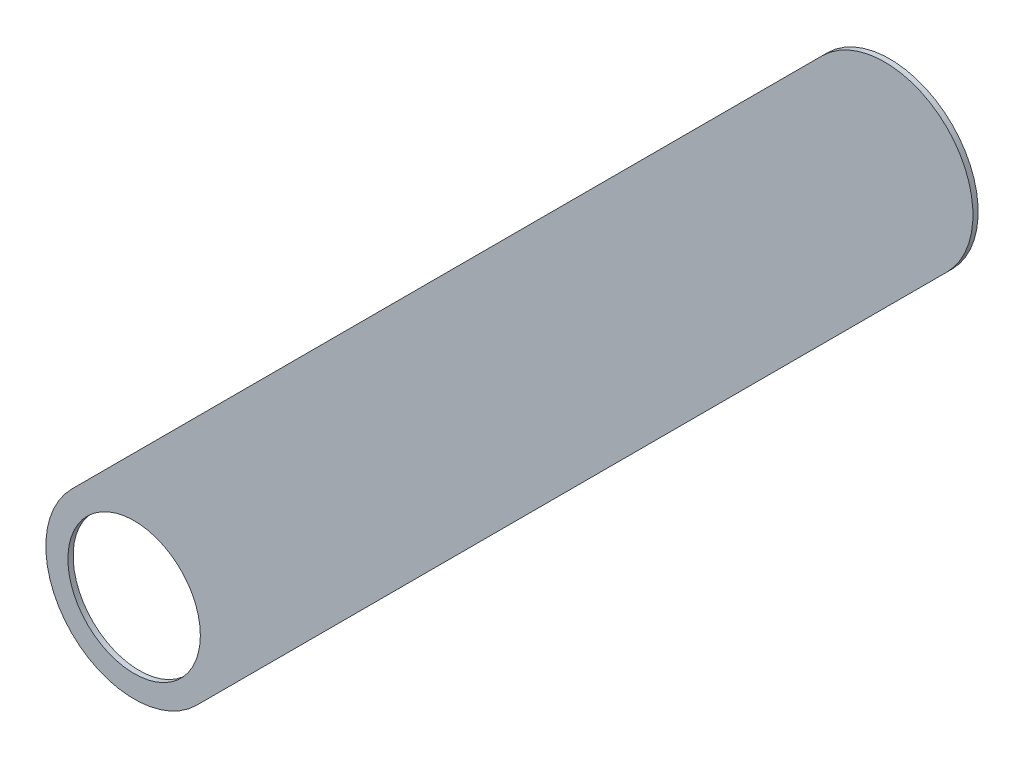
ISO-10303-21;
HEADER;
FILE_DESCRIPTION(('STEP AP214'),'2;1');
FILE_NAME('part.step','',(''),(''),'','','');
FILE_SCHEMA(('AUTOMOTIVE_DESIGN { 1 0 10303 214 1 1 1 1 }'));
ENDSEC;
DATA;
#1=APPLICATION_CONTEXT('core data for automotive mechanical design processes');
#2=APPLICATION_PROTOCOL_DEFINITION('international standard','automotive_design',2000,#1);
#3=PRODUCT_CONTEXT('',#1,'mechanical');
#4=PRODUCT('Part','Part','',(#3));
#5=PRODUCT_RELATED_PRODUCT_CATEGORY('part','',(#4));
#6=PRODUCT_DEFINITION_FORMATION('','',#4);
#7=PRODUCT_DEFINITION_CONTEXT('part definition',#1,'design');
#8=PRODUCT_DEFINITION('design','',#6,#7);
#9=PRODUCT_DEFINITION_SHAPE('','',#8);
#10=(LENGTH_UNIT() NAMED_UNIT(*) SI_UNIT(.MILLI.,.METRE.));
#11=(NAMED_UNIT(*) PLANE_ANGLE_UNIT() SI_UNIT($,.RADIAN.));
#12=(NAMED_UNIT(*) SI_UNIT($,.STERADIAN.) SOLID_ANGLE_UNIT());
#13=UNCERTAINTY_MEASURE_WITH_UNIT(LENGTH_MEASURE(1.E-05),#10,'distance_accuracy_value','');
#14=(GEOMETRIC_REPRESENTATION_CONTEXT(3) GLOBAL_UNCERTAINTY_ASSIGNED_CONTEXT((#13)) GLOBAL_UNIT_ASSIGNED_CONTEXT((#10,
#11,#12)) REPRESENTATION_CONTEXT('',''));
#15=CARTESIAN_POINT('',(0.,0.,0.));
#16=DIRECTION('',(0.,0.,1.));
#17=DIRECTION('',(1.,0.,0.));
#18=AXIS2_PLACEMENT_3D('',#15,#16,#17);
#19=CARTESIAN_POINT('',(117.72425782,71.51574978,0.));
#20=DIRECTION('',(-0.707106781186547,0.707106781186549,0.));
#21=DIRECTION('',(0.707106781186549,0.707106781186547,0.));
#22=AXIS2_PLACEMENT_3D('',#19,#20,#21);
#23=PLANE('',#22);
#24=DIRECTION('',(0.707106781186549,0.707106781186547,0.));
#25=VECTOR('',#24,1.);
#26=CARTESIAN_POINT('',(117.72425782,71.51574978,0.03556));
#27=LINE('',#26,#25);
#28=CARTESIAN_POINT('',(117.72425782,71.51574978,0.03556));
#29=VERTEX_POINT('',#28);
#30=CARTESIAN_POINT('',(122.82426286,76.61575482,0.03556));
#31=VERTEX_POINT('',#30);
#32=EDGE_CURVE('E11',#29,#31,#27,.T.);
#33=ORIENTED_EDGE('',*,*,#32,.F.);
#34=DIRECTION('',(0.,0.,1.));
#35=VECTOR('',#34,1.);
#36=CARTESIAN_POINT('',(117.72425782,71.51574978,0.));
#37=LINE('',#36,#35);
#38=CARTESIAN_POINT('',(117.72425782,71.51574978,0.));
#39=VERTEX_POINT('',#38);
#40=EDGE_CURVE('E24',#39,#29,#37,.T.);
#41=ORIENTED_EDGE('',*,*,#40,.F.);
#42=DIRECTION('',(0.707106781186549,0.707106781186547,0.));
#43=VECTOR('',#42,1.);
#44=CARTESIAN_POINT('',(117.72425782,71.51574978,0.));
#45=LINE('',#44,#43);
#46=CARTESIAN_POINT('',(122.82426286,76.61575482,0.));
#47=VERTEX_POINT('',#46);
#48=EDGE_CURVE('E96',#39,#47,#45,.T.);
#49=ORIENTED_EDGE('',*,*,#48,.T.);
#50=DIRECTION('',(0.,0.,1.));
#51=VECTOR('',#50,1.);
#52=CARTESIAN_POINT('',(122.82426286,76.61575482,0.));
#53=LINE('',#52,#51);
#54=EDGE_CURVE('E37',#47,#31,#53,.T.);
#55=ORIENTED_EDGE('',*,*,#54,.T.);
#56=EDGE_LOOP('',(#33,#41,#49,#55));
#57=FACE_BOUND('',#56,.T.);
#58=ADVANCED_FACE('F17',(#57),#23,.F.);
#59=CARTESIAN_POINT('',(117.299994,71.9400136,0.));
#60=DIRECTION('',(0.,0.,-1.));
#61=DIRECTION('',(-0.707106781186548,0.707106781186548,0.));
#62=AXIS2_PLACEMENT_3D('',#59,#60,#61);
#63=CYLINDRICAL_SURFACE('',#62,0.599999648268208);
#64=CARTESIAN_POINT('',(117.299994,71.9400136,0.03556));
#65=DIRECTION('',(0.,0.,1.));
#66=DIRECTION('',(-0.707106781186548,0.707106781186548,0.));
#67=AXIS2_PLACEMENT_3D('',#64,#65,#66);
#68=CIRCLE('',#67,0.599999648268208);
#69=CARTESIAN_POINT('',(116.87573018,72.36427742,0.03556));
#70=VERTEX_POINT('',#69);
#71=EDGE_CURVE('E92',#70,#29,#68,.T.);
#72=ORIENTED_EDGE('',*,*,#71,.F.);
#73=DIRECTION('',(0.,0.,1.));
#74=VECTOR('',#73,1.);
#75=CARTESIAN_POINT('',(116.87573018,72.36427742,0.));
#76=LINE('',#75,#74);
#77=CARTESIAN_POINT('',(116.87573018,72.36427742,0.));
#78=VERTEX_POINT('',#77);
#79=EDGE_CURVE('E90',#78,#70,#76,.T.);
#80=ORIENTED_EDGE('',*,*,#79,.F.);
#81=CARTESIAN_POINT('',(117.299994,71.9400136,0.));
#82=DIRECTION('',(0.,0.,1.));
#83=DIRECTION('',(-0.707106781186548,0.707106781186548,0.));
#84=AXIS2_PLACEMENT_3D('',#81,#82,#83);
#85=CIRCLE('',#84,0.599999648268208);
#86=EDGE_CURVE('E88',#78,#39,#85,.T.);
#87=ORIENTED_EDGE('',*,*,#86,.T.);
#88=ORIENTED_EDGE('',*,*,#40,.T.);
#89=EDGE_LOOP('',(#72,#80,#87,#88));
#90=FACE_BOUND('',#89,.T.);
#91=ADVANCED_FACE('F111',(#90),#63,.T.);
#92=CARTESIAN_POINT('',(122.39999904,77.04001864,0.));
#93=DIRECTION('',(0.,0.,-1.));
#94=DIRECTION('',(0.707106781186548,-0.707106781186548,0.));
#95=AXIS2_PLACEMENT_3D('',#92,#93,#94);
#96=CYLINDRICAL_SURFACE('',#95,0.599999648268218);
#97=CARTESIAN_POINT('',(122.39999904,77.04001864,0.03556));
#98=DIRECTION('',(0.,0.,1.));
#99=DIRECTION('',(0.707106781186548,-0.707106781186548,0.));
#100=AXIS2_PLACEMENT_3D('',#97,#98,#99);
#101=CIRCLE('',#100,0.599999648268218);
#102=CARTESIAN_POINT('',(121.97573522,77.46428246,0.03556));
#103=VERTEX_POINT('',#102);
#104=EDGE_CURVE('E85',#31,#103,#101,.T.);
#105=ORIENTED_EDGE('',*,*,#104,.F.);
#106=ORIENTED_EDGE('',*,*,#54,.F.);
#107=CARTESIAN_POINT('',(122.39999904,77.04001864,0.));
#108=DIRECTION('',(0.,0.,1.));
#109=DIRECTION('',(0.707106781186548,-0.707106781186548,0.));
#110=AXIS2_PLACEMENT_3D('',#107,#108,#109);
#111=CIRCLE('',#110,0.599999648268218);
#112=CARTESIAN_POINT('',(121.97573522,77.46428246,0.));
#113=VERTEX_POINT('',#112);
#114=EDGE_CURVE('E82',#47,#113,#111,.T.);
#115=ORIENTED_EDGE('',*,*,#114,.T.);
#116=DIRECTION('',(0.,0.,1.));
#117=VECTOR('',#116,1.);
#118=CARTESIAN_POINT('',(121.97573522,77.46428246,0.));
#119=LINE('',#118,#117);
#120=EDGE_CURVE('E80',#113,#103,#119,.T.);
#121=ORIENTED_EDGE('',*,*,#120,.T.);
#122=EDGE_LOOP('',(#105,#106,#115,#121));
#123=FACE_BOUND('',#122,.T.);
#124=ADVANCED_FACE('F104',(#123),#96,.T.);
#125=CARTESIAN_POINT('',(121.97573522,77.46428246,0.));
#126=DIRECTION('',(0.707106781186549,-0.707106781186547,0.));
#127=DIRECTION('',(-0.707106781186547,-0.707106781186549,0.));
#128=AXIS2_PLACEMENT_3D('',#125,#126,#127);
#129=PLANE('',#128);
#130=DIRECTION('',(-0.707106781186547,-0.707106781186549,0.));
#131=VECTOR('',#130,1.);
#132=CARTESIAN_POINT('',(121.97573522,77.46428246,0.03556));
#133=LINE('',#132,#131);
#134=EDGE_CURVE('E77',#103,#70,#133,.T.);
#135=ORIENTED_EDGE('',*,*,#134,.F.);
#136=ORIENTED_EDGE('',*,*,#120,.F.);
#137=DIRECTION('',(-0.707106781186547,-0.707106781186549,0.));
#138=VECTOR('',#137,1.);
#139=CARTESIAN_POINT('',(121.97573522,77.46428246,0.));
#140=LINE('',#139,#138);
#141=EDGE_CURVE('E68',#113,#78,#140,.T.);
#142=ORIENTED_EDGE('',*,*,#141,.T.);
#143=ORIENTED_EDGE('',*,*,#79,.T.);
#144=EDGE_LOOP('',(#135,#136,#142,#143));
#145=FACE_BOUND('',#144,.T.);
#146=ADVANCED_FACE('F110',(#145),#129,.F.);
#147=CARTESIAN_POINT('',(117.299994,71.9400136,0.));
#148=DIRECTION('',(0.,0.,-1.));
#149=DIRECTION('',(1.,0.,0.));
#150=AXIS2_PLACEMENT_3D('',#147,#148,#149);
#151=CYLINDRICAL_SURFACE('',#150,0.4499991);
#152=DIRECTION('',(0.,0.,1.));
#153=VECTOR('',#152,1.);
#154=CARTESIAN_POINT('',(117.7499931,71.9400136,0.));
#155=LINE('',#154,#153);
#156=CARTESIAN_POINT('',(117.7499931,71.9400136,0.));
#157=VERTEX_POINT('',#156);
#158=CARTESIAN_POINT('',(117.7499931,71.9400136,0.03556));
#159=VERTEX_POINT('',#158);
#160=EDGE_CURVE('E62',#157,#159,#155,.T.);
#161=ORIENTED_EDGE('',*,*,#160,.T.);
#162=CARTESIAN_POINT('',(117.299994,71.9400136,0.03556));
#163=DIRECTION('',(0.,0.,1.));
#164=DIRECTION('',(1.,0.,0.));
#165=AXIS2_PLACEMENT_3D('',#162,#163,#164);
#166=CIRCLE('',#165,0.4499991);
#167=EDGE_CURVE('E67',#159,#159,#166,.T.);
#168=ORIENTED_EDGE('',*,*,#167,.T.);
#169=ORIENTED_EDGE('',*,*,#160,.F.);
#170=CARTESIAN_POINT('',(117.299994,71.9400136,0.));
#171=DIRECTION('',(0.,0.,1.));
#172=DIRECTION('',(1.,0.,0.));
#173=AXIS2_PLACEMENT_3D('',#170,#171,#172);
#174=CIRCLE('',#173,0.4499991);
#175=EDGE_CURVE('E65',#157,#157,#174,.T.);
#176=ORIENTED_EDGE('',*,*,#175,.F.);
#177=EDGE_LOOP('',(#161,#168,#169,#176));
#178=FACE_BOUND('',#177,.T.);
#179=ADVANCED_FACE('F64',(#178),#151,.F.);
#180=CARTESIAN_POINT('',(117.72425782,71.51574978,0.));
#181=DIRECTION('',(0.,0.,-1.));
#182=DIRECTION('',(-1.,0.,0.));
#183=AXIS2_PLACEMENT_3D('',#180,#181,#182);
#184=PLANE('',#183);
#185=ORIENTED_EDGE('',*,*,#48,.F.);
#186=ORIENTED_EDGE('',*,*,#86,.F.);
#187=ORIENTED_EDGE('',*,*,#141,.F.);
#188=ORIENTED_EDGE('',*,*,#114,.F.);
#189=EDGE_LOOP('',(#185,#186,#187,#188));
#190=FACE_BOUND('',#189,.T.);
#191=ORIENTED_EDGE('',*,*,#175,.T.);
#192=EDGE_LOOP('',(#191));
#193=FACE_BOUND('',#192,.T.);
#194=ADVANCED_FACE('F71',(#190,#193),#184,.T.);
#195=CARTESIAN_POINT('',(117.72425782,71.51574978,0.03556));
#196=DIRECTION('',(0.,0.,-1.));
#197=DIRECTION('',(-1.,0.,0.));
#198=AXIS2_PLACEMENT_3D('',#195,#196,#197);
#199=PLANE('',#198);
#200=ORIENTED_EDGE('',*,*,#134,.T.);
#201=ORIENTED_EDGE('',*,*,#71,.T.);
#202=ORIENTED_EDGE('',*,*,#32,.T.);
#203=ORIENTED_EDGE('',*,*,#104,.T.);
#204=EDGE_LOOP('',(#200,#201,#202,#203));
#205=FACE_BOUND('',#204,.T.);
#206=ORIENTED_EDGE('',*,*,#167,.F.);
#207=EDGE_LOOP('',(#206));
#208=FACE_BOUND('',#207,.T.);
#209=ADVANCED_FACE('F107',(#205,#208),#199,.F.);
#210=CLOSED_SHELL('',(#58,#91,#124,#146,#179,#194,#209));
#211=MANIFOLD_SOLID_BREP('B1',#210);
#212=ADVANCED_BREP_SHAPE_REPRESENTATION('',(#18,#211),#14);
#213=SHAPE_DEFINITION_REPRESENTATION(#9,#212);
ENDSEC;
END-ISO-10303-21;
